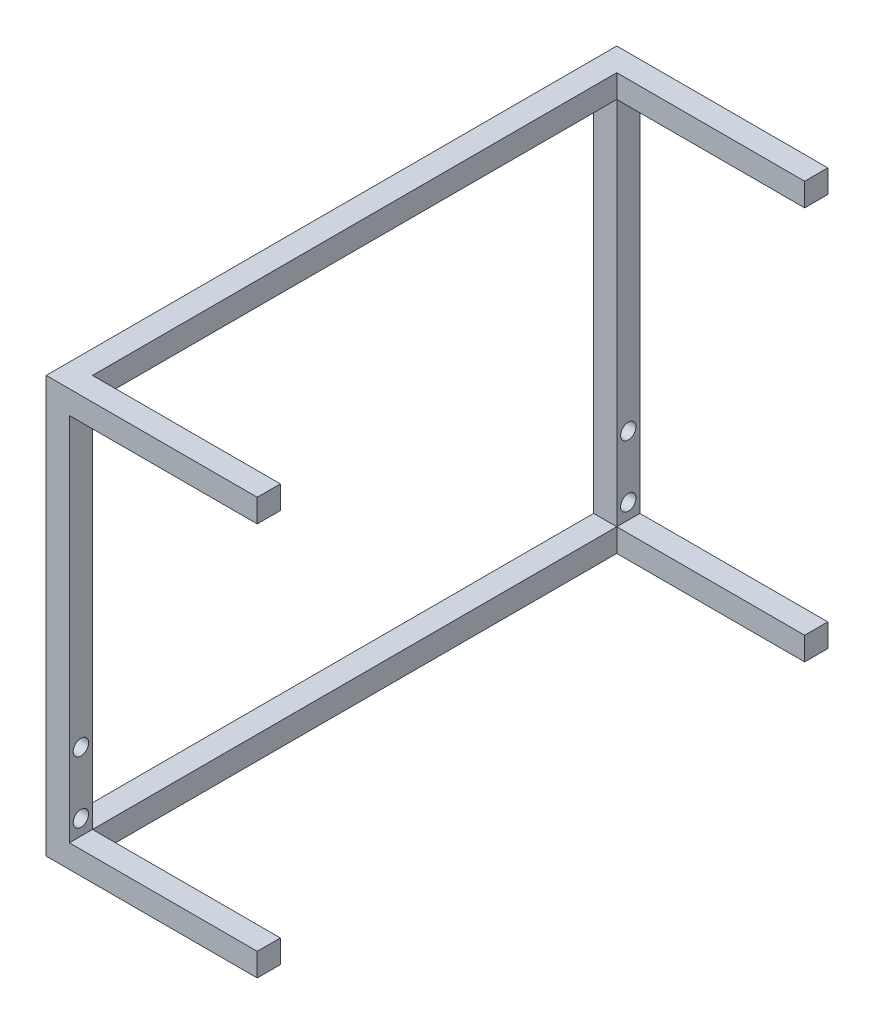
ISO-10303-21;
HEADER;
FILE_DESCRIPTION(('STEP AP214'),'2;1');
FILE_NAME('part.step','',(''),(''),'','','');
FILE_SCHEMA(('AUTOMOTIVE_DESIGN { 1 0 10303 214 1 1 1 1 }'));
ENDSEC;
DATA;
#1=APPLICATION_CONTEXT('core data for automotive mechanical design processes');
#2=APPLICATION_PROTOCOL_DEFINITION('international standard','automotive_design',2000,#1);
#3=PRODUCT_CONTEXT('',#1,'mechanical');
#4=PRODUCT('Part','Part','',(#3));
#5=PRODUCT_RELATED_PRODUCT_CATEGORY('part','',(#4));
#6=PRODUCT_DEFINITION_FORMATION('','',#4);
#7=PRODUCT_DEFINITION_CONTEXT('part definition',#1,'design');
#8=PRODUCT_DEFINITION('design','',#6,#7);
#9=PRODUCT_DEFINITION_SHAPE('','',#8);
#10=(LENGTH_UNIT() NAMED_UNIT(*) SI_UNIT(.MILLI.,.METRE.));
#11=(NAMED_UNIT(*) PLANE_ANGLE_UNIT() SI_UNIT($,.RADIAN.));
#12=(NAMED_UNIT(*) SI_UNIT($,.STERADIAN.) SOLID_ANGLE_UNIT());
#13=UNCERTAINTY_MEASURE_WITH_UNIT(LENGTH_MEASURE(1.E-05),#10,'distance_accuracy_value','');
#14=(GEOMETRIC_REPRESENTATION_CONTEXT(3) GLOBAL_UNCERTAINTY_ASSIGNED_CONTEXT((#13)) GLOBAL_UNIT_ASSIGNED_CONTEXT((#10,
#11,#12)) REPRESENTATION_CONTEXT('',''));
#15=CARTESIAN_POINT('',(0.,0.,0.));
#16=DIRECTION('',(0.,0.,1.));
#17=DIRECTION('',(1.,0.,0.));
#18=AXIS2_PLACEMENT_3D('',#15,#16,#17);
#19=CARTESIAN_POINT('',(19.05,0.,0.));
#20=DIRECTION('',(1.,0.,0.));
#21=DIRECTION('',(0.,0.,-1.));
#22=AXIS2_PLACEMENT_3D('',#19,#20,#21);
#23=PLANE('',#22);
#24=DIRECTION('',(0.,0.,-1.));
#25=VECTOR('',#24,1.);
#26=CARTESIAN_POINT('',(19.05,-66.9762658925101,0.));
#27=LINE('',#26,#25);
#28=CARTESIAN_POINT('',(19.05,-66.9762658925101,200.331506677718));
#29=VERTEX_POINT('',#28);
#30=CARTESIAN_POINT('',(19.05,-66.9762658925101,-231.468493322282));
#31=VERTEX_POINT('',#30);
#32=EDGE_CURVE('E52',#29,#31,#27,.T.);
#33=ORIENTED_EDGE('',*,*,#32,.T.);
#34=DIRECTION('',(0.,-1.,0.));
#35=VECTOR('',#34,1.);
#36=CARTESIAN_POINT('',(19.05,-47.9262658925101,-231.468493322282));
#37=LINE('',#36,#35);
#38=CARTESIAN_POINT('',(19.05,-47.9262658925101,-231.468493322282));
#39=VERTEX_POINT('',#38);
#40=EDGE_CURVE('E185',#39,#31,#37,.T.);
#41=ORIENTED_EDGE('',*,*,#40,.F.);
#42=DIRECTION('',(0.,0.,-1.));
#43=VECTOR('',#42,1.);
#44=CARTESIAN_POINT('',(19.05,-47.9262658925101,0.));
#45=LINE('',#44,#43);
#46=CARTESIAN_POINT('',(19.05,-47.9262658925101,200.331506677718));
#47=VERTEX_POINT('',#46);
#48=EDGE_CURVE('E280',#47,#39,#45,.T.);
#49=ORIENTED_EDGE('',*,*,#48,.F.);
#50=DIRECTION('',(0.,1.,0.));
#51=VECTOR('',#50,1.);
#52=CARTESIAN_POINT('',(19.05,-66.9762658925101,200.331506677718));
#53=LINE('',#52,#51);
#54=EDGE_CURVE('E235',#29,#47,#53,.T.);
#55=ORIENTED_EDGE('',*,*,#54,.F.);
#56=EDGE_LOOP('',(#33,#41,#49,#55));
#57=FACE_BOUND('',#56,.T.);
#58=ADVANCED_FACE('F35',(#57),#23,.T.);
#59=CARTESIAN_POINT('',(19.05,-35.2262658925101,-240.993493322282));
#60=DIRECTION('',(1.,0.,0.));
#61=DIRECTION('',(0.,0.,-1.));
#62=AXIS2_PLACEMENT_3D('',#59,#60,#61);
#63=CIRCLE('',#62,6.35);
#64=CARTESIAN_POINT('',(19.05,-35.2262658925101,-247.343493322282));
#65=VERTEX_POINT('',#64);
#66=EDGE_CURVE('E259',#65,#65,#63,.T.);
#67=ORIENTED_EDGE('',*,*,#66,.F.);
#68=EDGE_LOOP('',(#67));
#69=FACE_BOUND('',#68,.T.);
#70=CARTESIAN_POINT('',(19.05,15.5737341074899,-240.993493322282));
#71=DIRECTION('',(1.,0.,0.));
#72=DIRECTION('',(0.,0.,-1.));
#73=AXIS2_PLACEMENT_3D('',#70,#71,#72);
#74=CIRCLE('',#73,6.35);
#75=CARTESIAN_POINT('',(19.05,15.5737341074899,-247.343493322282));
#76=VERTEX_POINT('',#75);
#77=EDGE_CURVE('E262',#76,#76,#74,.T.);
#78=ORIENTED_EDGE('',*,*,#77,.F.);
#79=EDGE_LOOP('',(#78));
#80=FACE_BOUND('',#79,.T.);
#81=DIRECTION('',(0.,1.,0.));
#82=VECTOR('',#81,1.);
#83=CARTESIAN_POINT('',(19.05,0.,-231.468493322282));
#84=LINE('',#83,#82);
#85=CARTESIAN_POINT('',(19.05,256.87373410749,-231.468493322282));
#86=VERTEX_POINT('',#85);
#87=EDGE_CURVE('E288',#39,#86,#84,.T.);
#88=ORIENTED_EDGE('',*,*,#87,.F.);
#89=DIRECTION('',(0.,0.,1.));
#90=VECTOR('',#89,1.);
#91=CARTESIAN_POINT('',(19.05,-47.9262658925101,-231.468493322282));
#92=LINE('',#91,#90);
#93=CARTESIAN_POINT('',(19.05,-47.9262658925101,-250.518493322282));
#94=VERTEX_POINT('',#93);
#95=EDGE_CURVE('E182',#94,#39,#92,.T.);
#96=ORIENTED_EDGE('',*,*,#95,.F.);
#97=DIRECTION('',(0.,1.,0.));
#98=VECTOR('',#97,1.);
#99=CARTESIAN_POINT('',(19.05,0.,-250.518493322282));
#100=LINE('',#99,#98);
#101=CARTESIAN_POINT('',(19.05,256.87373410749,-250.518493322282));
#102=VERTEX_POINT('',#101);
#103=EDGE_CURVE('E276',#94,#102,#100,.T.);
#104=ORIENTED_EDGE('',*,*,#103,.T.);
#105=DIRECTION('',(0.,0.,-1.));
#106=VECTOR('',#105,1.);
#107=CARTESIAN_POINT('',(19.05,256.87373410749,-250.518493322282));
#108=LINE('',#107,#106);
#109=EDGE_CURVE('E189',#86,#102,#108,.T.);
#110=ORIENTED_EDGE('',*,*,#109,.F.);
#111=EDGE_LOOP('',(#88,#96,#104,#110));
#112=FACE_BOUND('',#111,.T.);
#113=ADVANCED_FACE('F357',(#69,#80,#112),#23,.T.);
#114=DIRECTION('',(0.,0.,-1.));
#115=VECTOR('',#114,1.);
#116=CARTESIAN_POINT('',(19.05,256.87373410749,0.));
#117=LINE('',#116,#115);
#118=CARTESIAN_POINT('',(19.05,256.87373410749,200.331506677718));
#119=VERTEX_POINT('',#118);
#120=EDGE_CURVE('E285',#119,#86,#117,.T.);
#121=ORIENTED_EDGE('',*,*,#120,.T.);
#122=DIRECTION('',(0.,-1.,0.));
#123=VECTOR('',#122,1.);
#124=CARTESIAN_POINT('',(19.05,275.92373410749,-231.468493322282));
#125=LINE('',#124,#123);
#126=CARTESIAN_POINT('',(19.05,275.92373410749,-231.468493322282));
#127=VERTEX_POINT('',#126);
#128=EDGE_CURVE('E186',#127,#86,#125,.T.);
#129=ORIENTED_EDGE('',*,*,#128,.F.);
#130=DIRECTION('',(0.,0.,-1.));
#131=VECTOR('',#130,1.);
#132=CARTESIAN_POINT('',(19.05,275.92373410749,0.));
#133=LINE('',#132,#131);
#134=CARTESIAN_POINT('',(19.05,275.92373410749,200.331506677718));
#135=VERTEX_POINT('',#134);
#136=EDGE_CURVE('E278',#135,#127,#133,.T.);
#137=ORIENTED_EDGE('',*,*,#136,.F.);
#138=DIRECTION('',(0.,1.,0.));
#139=VECTOR('',#138,1.);
#140=CARTESIAN_POINT('',(19.05,275.92373410749,200.331506677718));
#141=LINE('',#140,#139);
#142=EDGE_CURVE('E220',#119,#135,#141,.T.);
#143=ORIENTED_EDGE('',*,*,#142,.F.);
#144=EDGE_LOOP('',(#121,#129,#137,#143));
#145=FACE_BOUND('',#144,.T.);
#146=ADVANCED_FACE('F363',(#145),#23,.T.);
#147=CARTESIAN_POINT('',(19.05,-35.2262658925101,209.856506677718));
#148=DIRECTION('',(1.,0.,0.));
#149=DIRECTION('',(0.,0.,-1.));
#150=AXIS2_PLACEMENT_3D('',#147,#148,#149);
#151=CIRCLE('',#150,6.35);
#152=CARTESIAN_POINT('',(19.05,-35.2262658925101,203.506506677718));
#153=VERTEX_POINT('',#152);
#154=EDGE_CURVE('E263',#153,#153,#151,.T.);
#155=ORIENTED_EDGE('',*,*,#154,.F.);
#156=EDGE_LOOP('',(#155));
#157=FACE_BOUND('',#156,.T.);
#158=CARTESIAN_POINT('',(19.05,15.5737341074899,209.856506677718));
#159=DIRECTION('',(1.,0.,0.));
#160=DIRECTION('',(0.,0.,-1.));
#161=AXIS2_PLACEMENT_3D('',#158,#159,#160);
#162=CIRCLE('',#161,6.35);
#163=CARTESIAN_POINT('',(19.05,15.5737341074899,203.506506677718));
#164=VERTEX_POINT('',#163);
#165=EDGE_CURVE('E266',#164,#164,#162,.T.);
#166=ORIENTED_EDGE('',*,*,#165,.F.);
#167=EDGE_LOOP('',(#166));
#168=FACE_BOUND('',#167,.T.);
#169=DIRECTION('',(0.,-1.,0.));
#170=VECTOR('',#169,1.);
#171=CARTESIAN_POINT('',(19.05,0.,200.331506677718));
#172=LINE('',#171,#170);
#173=EDGE_CURVE('E283',#119,#47,#172,.T.);
#174=ORIENTED_EDGE('',*,*,#173,.F.);
#175=DIRECTION('',(0.,0.,-1.));
#176=VECTOR('',#175,1.);
#177=CARTESIAN_POINT('',(19.05,256.87373410749,219.381506677718));
#178=LINE('',#177,#176);
#179=CARTESIAN_POINT('',(19.05,256.87373410749,219.381506677718));
#180=VERTEX_POINT('',#179);
#181=EDGE_CURVE('E215',#180,#119,#178,.T.);
#182=ORIENTED_EDGE('',*,*,#181,.F.);
#183=DIRECTION('',(0.,-1.,0.));
#184=VECTOR('',#183,1.);
#185=CARTESIAN_POINT('',(19.05,0.,219.381506677718));
#186=LINE('',#185,#184);
#187=CARTESIAN_POINT('',(19.05,-47.9262658925101,219.381506677718));
#188=VERTEX_POINT('',#187);
#189=EDGE_CURVE('E272',#180,#188,#186,.T.);
#190=ORIENTED_EDGE('',*,*,#189,.T.);
#191=DIRECTION('',(0.,0.,1.));
#192=VECTOR('',#191,1.);
#193=CARTESIAN_POINT('',(19.05,-47.9262658925101,219.381506677718));
#194=LINE('',#193,#192);
#195=EDGE_CURVE('E240',#47,#188,#194,.T.);
#196=ORIENTED_EDGE('',*,*,#195,.F.);
#197=EDGE_LOOP('',(#174,#182,#190,#196));
#198=FACE_BOUND('',#197,.T.);
#199=ADVANCED_FACE('F359',(#157,#168,#198),#23,.T.);
#200=CARTESIAN_POINT('',(19.05,-47.9262658925101,0.));
#201=DIRECTION('',(0.,1.,0.));
#202=DIRECTION('',(0.,0.,1.));
#203=AXIS2_PLACEMENT_3D('',#200,#201,#202);
#204=PLANE('',#203);
#205=DIRECTION('',(0.,0.,-1.));
#206=VECTOR('',#205,1.);
#207=CARTESIAN_POINT('',(0.,-47.9262658925101,0.));
#208=LINE('',#207,#206);
#209=CARTESIAN_POINT('',(0.,-47.9262658925101,200.331506677718));
#210=VERTEX_POINT('',#209);
#211=CARTESIAN_POINT('',(0.,-47.9262658925101,-231.468493322282));
#212=VERTEX_POINT('',#211);
#213=EDGE_CURVE('E303',#210,#212,#208,.T.);
#214=ORIENTED_EDGE('',*,*,#213,.F.);
#215=DIRECTION('',(-1.,0.,0.));
#216=VECTOR('',#215,1.);
#217=CARTESIAN_POINT('',(19.05,-47.9262658925101,200.331506677718));
#218=LINE('',#217,#216);
#219=EDGE_CURVE('E11',#47,#210,#218,.T.);
#220=ORIENTED_EDGE('',*,*,#219,.F.);
#221=ORIENTED_EDGE('',*,*,#48,.T.);
#222=DIRECTION('',(-1.,0.,0.));
#223=VECTOR('',#222,1.);
#224=CARTESIAN_POINT('',(19.05,-47.9262658925101,-231.468493322282));
#225=LINE('',#224,#223);
#226=EDGE_CURVE('E314',#39,#212,#225,.T.);
#227=ORIENTED_EDGE('',*,*,#226,.T.);
#228=EDGE_LOOP('',(#214,#220,#221,#227));
#229=FACE_BOUND('',#228,.T.);
#230=ADVANCED_FACE('F368',(#229),#204,.T.);
#231=CARTESIAN_POINT('',(19.05,0.,200.331506677718));
#232=DIRECTION('',(0.,0.,-1.));
#233=DIRECTION('',(0.,1.,0.));
#234=AXIS2_PLACEMENT_3D('',#231,#232,#233);
#235=PLANE('',#234);
#236=DIRECTION('',(0.,-1.,0.));
#237=VECTOR('',#236,1.);
#238=CARTESIAN_POINT('',(0.,0.,200.331506677718));
#239=LINE('',#238,#237);
#240=CARTESIAN_POINT('',(0.,256.87373410749,200.331506677718));
#241=VERTEX_POINT('',#240);
#242=EDGE_CURVE('E306',#241,#210,#239,.T.);
#243=ORIENTED_EDGE('',*,*,#242,.F.);
#244=DIRECTION('',(-1.,0.,0.));
#245=VECTOR('',#244,1.);
#246=CARTESIAN_POINT('',(19.05,256.87373410749,200.331506677718));
#247=LINE('',#246,#245);
#248=EDGE_CURVE('E44',#119,#241,#247,.T.);
#249=ORIENTED_EDGE('',*,*,#248,.F.);
#250=ORIENTED_EDGE('',*,*,#173,.T.);
#251=ORIENTED_EDGE('',*,*,#219,.T.);
#252=EDGE_LOOP('',(#243,#249,#250,#251));
#253=FACE_BOUND('',#252,.T.);
#254=ADVANCED_FACE('F374',(#253),#235,.T.);
#255=CARTESIAN_POINT('',(19.05,256.87373410749,0.));
#256=DIRECTION('',(0.,1.,0.));
#257=DIRECTION('',(0.,0.,1.));
#258=AXIS2_PLACEMENT_3D('',#255,#256,#257);
#259=PLANE('',#258);
#260=DIRECTION('',(0.,0.,-1.));
#261=VECTOR('',#260,1.);
#262=CARTESIAN_POINT('',(0.,256.87373410749,0.));
#263=LINE('',#262,#261);
#264=CARTESIAN_POINT('',(0.,256.87373410749,-231.468493322282));
#265=VERTEX_POINT('',#264);
#266=EDGE_CURVE('E309',#241,#265,#263,.T.);
#267=ORIENTED_EDGE('',*,*,#266,.T.);
#268=DIRECTION('',(-1.,0.,0.));
#269=VECTOR('',#268,1.);
#270=CARTESIAN_POINT('',(19.05,256.87373410749,-231.468493322282));
#271=LINE('',#270,#269);
#272=EDGE_CURVE('E316',#86,#265,#271,.T.);
#273=ORIENTED_EDGE('',*,*,#272,.F.);
#274=ORIENTED_EDGE('',*,*,#120,.F.);
#275=ORIENTED_EDGE('',*,*,#248,.T.);
#276=EDGE_LOOP('',(#267,#273,#274,#275));
#277=FACE_BOUND('',#276,.T.);
#278=ADVANCED_FACE('F400',(#277),#259,.F.);
#279=CARTESIAN_POINT('',(19.05,0.,219.381506677718));
#280=DIRECTION('',(0.,0.,-1.));
#281=DIRECTION('',(0.,1.,0.));
#282=AXIS2_PLACEMENT_3D('',#279,#280,#281);
#283=PLANE('',#282);
#284=DIRECTION('',(0.,-1.,0.));
#285=VECTOR('',#284,1.);
#286=CARTESIAN_POINT('',(0.,0.,219.381506677718));
#287=LINE('',#286,#285);
#288=CARTESIAN_POINT('',(0.,275.92373410749,219.381506677718));
#289=VERTEX_POINT('',#288);
#290=CARTESIAN_POINT('',(0.,-66.9762658925101,219.381506677718));
#291=VERTEX_POINT('',#290);
#292=EDGE_CURVE('E292',#289,#291,#287,.T.);
#293=ORIENTED_EDGE('',*,*,#292,.T.);
#294=DIRECTION('',(-1.,0.,0.));
#295=VECTOR('',#294,1.);
#296=CARTESIAN_POINT('',(19.05,-66.9762658925101,219.381506677718));
#297=LINE('',#296,#295);
#298=CARTESIAN_POINT('',(173.7995,-66.9762658925101,219.381506677718));
#299=VERTEX_POINT('',#298);
#300=EDGE_CURVE('E317',#299,#291,#297,.T.);
#301=ORIENTED_EDGE('',*,*,#300,.F.);
#302=DIRECTION('',(0.,-1.,0.));
#303=VECTOR('',#302,1.);
#304=CARTESIAN_POINT('',(173.7995,-66.9762658925101,219.381506677718));
#305=LINE('',#304,#303);
#306=CARTESIAN_POINT('',(173.7995,-47.9262658925101,219.381506677718));
#307=VERTEX_POINT('',#306);
#308=EDGE_CURVE('E236',#307,#299,#305,.T.);
#309=ORIENTED_EDGE('',*,*,#308,.F.);
#310=DIRECTION('',(-1.,0.,0.));
#311=VECTOR('',#310,1.);
#312=CARTESIAN_POINT('',(173.7995,-47.9262658925101,219.381506677718));
#313=LINE('',#312,#311);
#314=EDGE_CURVE('E246',#307,#188,#313,.T.);
#315=ORIENTED_EDGE('',*,*,#314,.T.);
#316=ORIENTED_EDGE('',*,*,#189,.F.);
#317=DIRECTION('',(-1.,0.,0.));
#318=VECTOR('',#317,1.);
#319=CARTESIAN_POINT('',(173.7995,256.87373410749,219.381506677718));
#320=LINE('',#319,#318);
#321=CARTESIAN_POINT('',(173.7995,256.87373410749,219.381506677718));
#322=VERTEX_POINT('',#321);
#323=EDGE_CURVE('E233',#322,#180,#320,.T.);
#324=ORIENTED_EDGE('',*,*,#323,.F.);
#325=DIRECTION('',(0.,-1.,0.));
#326=VECTOR('',#325,1.);
#327=CARTESIAN_POINT('',(173.7995,275.92373410749,219.381506677718));
#328=LINE('',#327,#326);
#329=CARTESIAN_POINT('',(173.7995,275.92373410749,219.381506677718));
#330=VERTEX_POINT('',#329);
#331=EDGE_CURVE('E216',#330,#322,#328,.T.);
#332=ORIENTED_EDGE('',*,*,#331,.F.);
#333=DIRECTION('',(-1.,0.,0.));
#334=VECTOR('',#333,1.);
#335=CARTESIAN_POINT('',(19.05,275.92373410749,219.381506677718));
#336=LINE('',#335,#334);
#337=EDGE_CURVE('E291',#330,#289,#336,.T.);
#338=ORIENTED_EDGE('',*,*,#337,.T.);
#339=EDGE_LOOP('',(#293,#301,#309,#315,#316,#324,#332,#338));
#340=FACE_BOUND('',#339,.T.);
#341=ADVANCED_FACE('F37',(#340),#283,.F.);
#342=CARTESIAN_POINT('',(19.05,-66.9762658925101,0.));
#343=DIRECTION('',(0.,1.,0.));
#344=DIRECTION('',(0.,0.,1.));
#345=AXIS2_PLACEMENT_3D('',#342,#343,#344);
#346=PLANE('',#345);
#347=DIRECTION('',(0.,0.,-1.));
#348=VECTOR('',#347,1.);
#349=CARTESIAN_POINT('',(0.,-66.9762658925101,0.));
#350=LINE('',#349,#348);
#351=CARTESIAN_POINT('',(0.,-66.9762658925101,-250.518493322282));
#352=VERTEX_POINT('',#351);
#353=EDGE_CURVE('E295',#291,#352,#350,.T.);
#354=ORIENTED_EDGE('',*,*,#353,.T.);
#355=DIRECTION('',(-1.,0.,0.));
#356=VECTOR('',#355,1.);
#357=CARTESIAN_POINT('',(19.05,-66.9762658925101,-250.518493322282));
#358=LINE('',#357,#356);
#359=CARTESIAN_POINT('',(173.7995,-66.9762658925101,-250.518493322282));
#360=VERTEX_POINT('',#359);
#361=EDGE_CURVE('E169',#360,#352,#358,.T.);
#362=ORIENTED_EDGE('',*,*,#361,.F.);
#363=DIRECTION('',(0.,0.,-1.));
#364=VECTOR('',#363,1.);
#365=CARTESIAN_POINT('',(173.7995,-66.9762658925101,-231.468493322282));
#366=LINE('',#365,#364);
#367=CARTESIAN_POINT('',(173.7995,-66.9762658925101,-231.468493322282));
#368=VERTEX_POINT('',#367);
#369=EDGE_CURVE('E162',#368,#360,#366,.T.);
#370=ORIENTED_EDGE('',*,*,#369,.F.);
#371=DIRECTION('',(-1.,0.,0.));
#372=VECTOR('',#371,1.);
#373=CARTESIAN_POINT('',(173.7995,-66.9762658925101,-231.468493322282));
#374=LINE('',#373,#372);
#375=EDGE_CURVE('E166',#368,#31,#374,.T.);
#376=ORIENTED_EDGE('',*,*,#375,.T.);
#377=ORIENTED_EDGE('',*,*,#32,.F.);
#378=DIRECTION('',(-1.,0.,0.));
#379=VECTOR('',#378,1.);
#380=CARTESIAN_POINT('',(173.7995,-66.9762658925101,200.331506677718));
#381=LINE('',#380,#379);
#382=CARTESIAN_POINT('',(173.7995,-66.9762658925101,200.331506677718));
#383=VERTEX_POINT('',#382);
#384=EDGE_CURVE('E256',#383,#29,#381,.T.);
#385=ORIENTED_EDGE('',*,*,#384,.F.);
#386=DIRECTION('',(0.,0.,-1.));
#387=VECTOR('',#386,1.);
#388=CARTESIAN_POINT('',(173.7995,-66.9762658925101,219.381506677718));
#389=LINE('',#388,#387);
#390=EDGE_CURVE('E239',#299,#383,#389,.T.);
#391=ORIENTED_EDGE('',*,*,#390,.F.);
#392=ORIENTED_EDGE('',*,*,#300,.T.);
#393=EDGE_LOOP('',(#354,#362,#370,#376,#377,#385,#391,#392));
#394=FACE_BOUND('',#393,.T.);
#395=ADVANCED_FACE('F164',(#394),#346,.F.);
#396=CARTESIAN_POINT('',(19.05,0.,-250.518493322282));
#397=DIRECTION('',(0.,0.,1.));
#398=DIRECTION('',(1.,0.,0.));
#399=AXIS2_PLACEMENT_3D('',#396,#397,#398);
#400=PLANE('',#399);
#401=DIRECTION('',(0.,1.,0.));
#402=VECTOR('',#401,1.);
#403=CARTESIAN_POINT('',(0.,0.,-250.518493322282));
#404=LINE('',#403,#402);
#405=CARTESIAN_POINT('',(0.,275.92373410749,-250.518493322282));
#406=VERTEX_POINT('',#405);
#407=EDGE_CURVE('E297',#352,#406,#404,.T.);
#408=ORIENTED_EDGE('',*,*,#407,.T.);
#409=DIRECTION('',(-1.,0.,0.));
#410=VECTOR('',#409,1.);
#411=CARTESIAN_POINT('',(19.05,275.92373410749,-250.518493322282));
#412=LINE('',#411,#410);
#413=CARTESIAN_POINT('',(173.7995,275.92373410749,-250.518493322282));
#414=VERTEX_POINT('',#413);
#415=EDGE_CURVE('E321',#414,#406,#412,.T.);
#416=ORIENTED_EDGE('',*,*,#415,.F.);
#417=DIRECTION('',(0.,1.,0.));
#418=VECTOR('',#417,1.);
#419=CARTESIAN_POINT('',(173.7995,275.92373410749,-250.518493322282));
#420=LINE('',#419,#418);
#421=CARTESIAN_POINT('',(173.7995,256.87373410749,-250.518493322282));
#422=VERTEX_POINT('',#421);
#423=EDGE_CURVE('E196',#422,#414,#420,.T.);
#424=ORIENTED_EDGE('',*,*,#423,.F.);
#425=DIRECTION('',(-1.,0.,0.));
#426=VECTOR('',#425,1.);
#427=CARTESIAN_POINT('',(173.7995,256.87373410749,-250.518493322282));
#428=LINE('',#427,#426);
#429=EDGE_CURVE('E204',#422,#102,#428,.T.);
#430=ORIENTED_EDGE('',*,*,#429,.T.);
#431=ORIENTED_EDGE('',*,*,#103,.F.);
#432=DIRECTION('',(-1.,0.,0.));
#433=VECTOR('',#432,1.);
#434=CARTESIAN_POINT('',(173.7995,-47.9262658925101,-250.518493322282));
#435=LINE('',#434,#433);
#436=CARTESIAN_POINT('',(173.7995,-47.9262658925101,-250.518493322282));
#437=VERTEX_POINT('',#436);
#438=EDGE_CURVE('E187',#437,#94,#435,.T.);
#439=ORIENTED_EDGE('',*,*,#438,.F.);
#440=DIRECTION('',(0.,1.,0.));
#441=VECTOR('',#440,1.);
#442=CARTESIAN_POINT('',(173.7995,-47.9262658925101,-250.518493322282));
#443=LINE('',#442,#441);
#444=EDGE_CURVE('E172',#360,#437,#443,.T.);
#445=ORIENTED_EDGE('',*,*,#444,.F.);
#446=ORIENTED_EDGE('',*,*,#361,.T.);
#447=EDGE_LOOP('',(#408,#416,#424,#430,#431,#439,#445,#446));
#448=FACE_BOUND('',#447,.T.);
#449=ADVANCED_FACE('F432',(#448),#400,.F.);
#450=CARTESIAN_POINT('',(19.05,275.92373410749,0.));
#451=DIRECTION('',(0.,1.,0.));
#452=DIRECTION('',(0.,0.,1.));
#453=AXIS2_PLACEMENT_3D('',#450,#451,#452);
#454=PLANE('',#453);
#455=DIRECTION('',(0.,0.,-1.));
#456=VECTOR('',#455,1.);
#457=CARTESIAN_POINT('',(0.,275.92373410749,0.));
#458=LINE('',#457,#456);
#459=EDGE_CURVE('E300',#289,#406,#458,.T.);
#460=ORIENTED_EDGE('',*,*,#459,.F.);
#461=ORIENTED_EDGE('',*,*,#337,.F.);
#462=DIRECTION('',(0.,0.,1.));
#463=VECTOR('',#462,1.);
#464=CARTESIAN_POINT('',(173.7995,275.92373410749,219.381506677718));
#465=LINE('',#464,#463);
#466=CARTESIAN_POINT('',(173.7995,275.92373410749,200.331506677718));
#467=VERTEX_POINT('',#466);
#468=EDGE_CURVE('E224',#467,#330,#465,.T.);
#469=ORIENTED_EDGE('',*,*,#468,.F.);
#470=DIRECTION('',(-1.,0.,0.));
#471=VECTOR('',#470,1.);
#472=CARTESIAN_POINT('',(173.7995,275.92373410749,200.331506677718));
#473=LINE('',#472,#471);
#474=EDGE_CURVE('E60',#467,#135,#473,.T.);
#475=ORIENTED_EDGE('',*,*,#474,.T.);
#476=ORIENTED_EDGE('',*,*,#136,.T.);
#477=DIRECTION('',(-1.,0.,0.));
#478=VECTOR('',#477,1.);
#479=CARTESIAN_POINT('',(173.7995,275.92373410749,-231.468493322282));
#480=LINE('',#479,#478);
#481=CARTESIAN_POINT('',(173.7995,275.92373410749,-231.468493322282));
#482=VERTEX_POINT('',#481);
#483=EDGE_CURVE('E213',#482,#127,#480,.T.);
#484=ORIENTED_EDGE('',*,*,#483,.F.);
#485=DIRECTION('',(0.,0.,1.));
#486=VECTOR('',#485,1.);
#487=CARTESIAN_POINT('',(173.7995,275.92373410749,-250.518493322282));
#488=LINE('',#487,#486);
#489=EDGE_CURVE('E199',#414,#482,#488,.T.);
#490=ORIENTED_EDGE('',*,*,#489,.F.);
#491=ORIENTED_EDGE('',*,*,#415,.T.);
#492=EDGE_LOOP('',(#460,#461,#469,#475,#476,#484,#490,#491));
#493=FACE_BOUND('',#492,.T.);
#494=ADVANCED_FACE('F427',(#493),#454,.T.);
#495=CARTESIAN_POINT('',(19.05,0.,-231.468493322282));
#496=DIRECTION('',(0.,0.,1.));
#497=DIRECTION('',(0.,-1.,0.));
#498=AXIS2_PLACEMENT_3D('',#495,#496,#497);
#499=PLANE('',#498);
#500=DIRECTION('',(0.,1.,0.));
#501=VECTOR('',#500,1.);
#502=CARTESIAN_POINT('',(0.,0.,-231.468493322282));
#503=LINE('',#502,#501);
#504=EDGE_CURVE('E274',#212,#265,#503,.T.);
#505=ORIENTED_EDGE('',*,*,#504,.F.);
#506=ORIENTED_EDGE('',*,*,#226,.F.);
#507=ORIENTED_EDGE('',*,*,#87,.T.);
#508=ORIENTED_EDGE('',*,*,#272,.T.);
#509=EDGE_LOOP('',(#505,#506,#507,#508));
#510=FACE_BOUND('',#509,.T.);
#511=ADVANCED_FACE('F445',(#510),#499,.T.);
#512=CARTESIAN_POINT('',(0.,0.,0.));
#513=DIRECTION('',(1.,0.,0.));
#514=DIRECTION('',(0.,0.,-1.));
#515=AXIS2_PLACEMENT_3D('',#512,#513,#514);
#516=PLANE('',#515);
#517=CARTESIAN_POINT('',(0.,-35.2262658925101,209.856506677718));
#518=DIRECTION('',(1.,0.,0.));
#519=DIRECTION('',(0.,0.,-1.));
#520=AXIS2_PLACEMENT_3D('',#517,#518,#519);
#521=CIRCLE('',#520,6.35);
#522=CARTESIAN_POINT('',(0.,-35.2262658925101,203.506506677718));
#523=VERTEX_POINT('',#522);
#524=EDGE_CURVE('E39',#523,#523,#521,.T.);
#525=ORIENTED_EDGE('',*,*,#524,.T.);
#526=EDGE_LOOP('',(#525));
#527=FACE_BOUND('',#526,.T.);
#528=CARTESIAN_POINT('',(0.,15.5737341074899,-240.993493322282));
#529=DIRECTION('',(1.,0.,0.));
#530=DIRECTION('',(0.,0.,-1.));
#531=AXIS2_PLACEMENT_3D('',#528,#529,#530);
#532=CIRCLE('',#531,6.35);
#533=CARTESIAN_POINT('',(0.,15.5737341074899,-247.343493322282));
#534=VERTEX_POINT('',#533);
#535=EDGE_CURVE('E330',#534,#534,#532,.T.);
#536=ORIENTED_EDGE('',*,*,#535,.T.);
#537=EDGE_LOOP('',(#536));
#538=FACE_BOUND('',#537,.T.);
#539=CARTESIAN_POINT('',(0.,-35.2262658925101,-240.993493322282));
#540=DIRECTION('',(1.,0.,0.));
#541=DIRECTION('',(0.,0.,-1.));
#542=AXIS2_PLACEMENT_3D('',#539,#540,#541);
#543=CIRCLE('',#542,6.35);
#544=CARTESIAN_POINT('',(0.,-35.2262658925101,-247.343493322282));
#545=VERTEX_POINT('',#544);
#546=EDGE_CURVE('E328',#545,#545,#543,.T.);
#547=ORIENTED_EDGE('',*,*,#546,.T.);
#548=EDGE_LOOP('',(#547));
#549=FACE_BOUND('',#548,.T.);
#550=CARTESIAN_POINT('',(0.,15.5737341074899,209.856506677718));
#551=DIRECTION('',(1.,0.,0.));
#552=DIRECTION('',(0.,0.,-1.));
#553=AXIS2_PLACEMENT_3D('',#550,#551,#552);
#554=CIRCLE('',#553,6.35);
#555=CARTESIAN_POINT('',(0.,15.5737341074899,203.506506677718));
#556=VERTEX_POINT('',#555);
#557=EDGE_CURVE('E271',#556,#556,#554,.T.);
#558=ORIENTED_EDGE('',*,*,#557,.T.);
#559=EDGE_LOOP('',(#558));
#560=FACE_BOUND('',#559,.T.);
#561=ORIENTED_EDGE('',*,*,#292,.F.);
#562=ORIENTED_EDGE('',*,*,#459,.T.);
#563=ORIENTED_EDGE('',*,*,#407,.F.);
#564=ORIENTED_EDGE('',*,*,#353,.F.);
#565=EDGE_LOOP('',(#561,#562,#563,#564));
#566=FACE_BOUND('',#565,.T.);
#567=ORIENTED_EDGE('',*,*,#213,.T.);
#568=ORIENTED_EDGE('',*,*,#504,.T.);
#569=ORIENTED_EDGE('',*,*,#266,.F.);
#570=ORIENTED_EDGE('',*,*,#242,.T.);
#571=EDGE_LOOP('',(#567,#568,#569,#570));
#572=FACE_BOUND('',#571,.T.);
#573=ADVANCED_FACE('F337',(#527,#538,#549,#560,#566,#572),#516,.F.);
#574=CARTESIAN_POINT('',(-6.35,15.5737341074899,209.856506677718));
#575=DIRECTION('',(1.,0.,0.));
#576=DIRECTION('',(0.,0.,-1.));
#577=AXIS2_PLACEMENT_3D('',#574,#575,#576);
#578=CYLINDRICAL_SURFACE('',#577,6.35);
#579=ORIENTED_EDGE('',*,*,#165,.T.);
#580=EDGE_LOOP('',(#579));
#581=FACE_BOUND('',#580,.T.);
#582=ORIENTED_EDGE('',*,*,#557,.F.);
#583=EDGE_LOOP('',(#582));
#584=FACE_BOUND('',#583,.T.);
#585=ADVANCED_FACE('F452',(#581,#584),#578,.F.);
#586=CARTESIAN_POINT('',(-6.35,-35.2262658925101,-240.993493322282));
#587=DIRECTION('',(1.,0.,0.));
#588=DIRECTION('',(0.,0.,-1.));
#589=AXIS2_PLACEMENT_3D('',#586,#587,#588);
#590=CYLINDRICAL_SURFACE('',#589,6.35);
#591=ORIENTED_EDGE('',*,*,#66,.T.);
#592=EDGE_LOOP('',(#591));
#593=FACE_BOUND('',#592,.T.);
#594=ORIENTED_EDGE('',*,*,#546,.F.);
#595=EDGE_LOOP('',(#594));
#596=FACE_BOUND('',#595,.T.);
#597=ADVANCED_FACE('F352',(#593,#596),#590,.F.);
#598=CARTESIAN_POINT('',(-6.35,15.5737341074899,-240.993493322282));
#599=DIRECTION('',(1.,0.,0.));
#600=DIRECTION('',(0.,0.,-1.));
#601=AXIS2_PLACEMENT_3D('',#598,#599,#600);
#602=CYLINDRICAL_SURFACE('',#601,6.35);
#603=ORIENTED_EDGE('',*,*,#77,.T.);
#604=EDGE_LOOP('',(#603));
#605=FACE_BOUND('',#604,.T.);
#606=ORIENTED_EDGE('',*,*,#535,.F.);
#607=EDGE_LOOP('',(#606));
#608=FACE_BOUND('',#607,.T.);
#609=ADVANCED_FACE('F342',(#605,#608),#602,.F.);
#610=CARTESIAN_POINT('',(-6.35,-35.2262658925101,209.856506677718));
#611=DIRECTION('',(1.,0.,0.));
#612=DIRECTION('',(0.,0.,-1.));
#613=AXIS2_PLACEMENT_3D('',#610,#611,#612);
#614=CYLINDRICAL_SURFACE('',#613,6.35);
#615=ORIENTED_EDGE('',*,*,#154,.T.);
#616=EDGE_LOOP('',(#615));
#617=FACE_BOUND('',#616,.T.);
#618=ORIENTED_EDGE('',*,*,#524,.F.);
#619=EDGE_LOOP('',(#618));
#620=FACE_BOUND('',#619,.T.);
#621=ADVANCED_FACE('F339',(#617,#620),#614,.F.);
#622=CARTESIAN_POINT('',(173.7995,-66.9762658925101,200.331506677718));
#623=DIRECTION('',(0.,0.,1.));
#624=DIRECTION('',(1.,0.,0.));
#625=AXIS2_PLACEMENT_3D('',#622,#623,#624);
#626=PLANE('',#625);
#627=ORIENTED_EDGE('',*,*,#54,.T.);
#628=DIRECTION('',(-1.,0.,0.));
#629=VECTOR('',#628,1.);
#630=CARTESIAN_POINT('',(173.7995,-47.9262658925101,200.331506677718));
#631=LINE('',#630,#629);
#632=CARTESIAN_POINT('',(173.7995,-47.9262658925101,200.331506677718));
#633=VERTEX_POINT('',#632);
#634=EDGE_CURVE('E253',#633,#47,#631,.T.);
#635=ORIENTED_EDGE('',*,*,#634,.F.);
#636=DIRECTION('',(0.,1.,0.));
#637=VECTOR('',#636,1.);
#638=CARTESIAN_POINT('',(173.7995,-66.9762658925101,200.331506677718));
#639=LINE('',#638,#637);
#640=EDGE_CURVE('E242',#383,#633,#639,.T.);
#641=ORIENTED_EDGE('',*,*,#640,.F.);
#642=ORIENTED_EDGE('',*,*,#384,.T.);
#643=EDGE_LOOP('',(#627,#635,#641,#642));
#644=FACE_BOUND('',#643,.T.);
#645=ADVANCED_FACE('F341',(#644),#626,.F.);
#646=CARTESIAN_POINT('',(173.7995,-47.9262658925101,219.381506677718));
#647=DIRECTION('',(0.,-1.,0.));
#648=DIRECTION('',(0.,0.,-1.));
#649=AXIS2_PLACEMENT_3D('',#646,#647,#648);
#650=PLANE('',#649);
#651=ORIENTED_EDGE('',*,*,#195,.T.);
#652=ORIENTED_EDGE('',*,*,#314,.F.);
#653=DIRECTION('',(0.,0.,1.));
#654=VECTOR('',#653,1.);
#655=CARTESIAN_POINT('',(173.7995,-47.9262658925101,219.381506677718));
#656=LINE('',#655,#654);
#657=EDGE_CURVE('E244',#633,#307,#656,.T.);
#658=ORIENTED_EDGE('',*,*,#657,.F.);
#659=ORIENTED_EDGE('',*,*,#634,.T.);
#660=EDGE_LOOP('',(#651,#652,#658,#659));
#661=FACE_BOUND('',#660,.T.);
#662=ADVANCED_FACE('F349',(#661),#650,.F.);
#663=CARTESIAN_POINT('',(173.7995,0.,0.));
#664=DIRECTION('',(-1.,0.,0.));
#665=DIRECTION('',(0.,0.,1.));
#666=AXIS2_PLACEMENT_3D('',#663,#664,#665);
#667=PLANE('',#666);
#668=ORIENTED_EDGE('',*,*,#308,.T.);
#669=ORIENTED_EDGE('',*,*,#390,.T.);
#670=ORIENTED_EDGE('',*,*,#640,.T.);
#671=ORIENTED_EDGE('',*,*,#657,.T.);
#672=EDGE_LOOP('',(#668,#669,#670,#671));
#673=FACE_BOUND('',#672,.T.);
#674=ADVANCED_FACE('F422',(#673),#667,.F.);
#675=CARTESIAN_POINT('',(173.7995,256.87373410749,219.381506677718));
#676=DIRECTION('',(0.,1.,0.));
#677=DIRECTION('',(0.,0.,1.));
#678=AXIS2_PLACEMENT_3D('',#675,#676,#677);
#679=PLANE('',#678);
#680=ORIENTED_EDGE('',*,*,#181,.T.);
#681=DIRECTION('',(-1.,0.,0.));
#682=VECTOR('',#681,1.);
#683=CARTESIAN_POINT('',(173.7995,256.87373410749,200.331506677718));
#684=LINE('',#683,#682);
#685=CARTESIAN_POINT('',(173.7995,256.87373410749,200.331506677718));
#686=VERTEX_POINT('',#685);
#687=EDGE_CURVE('E230',#686,#119,#684,.T.);
#688=ORIENTED_EDGE('',*,*,#687,.F.);
#689=DIRECTION('',(0.,0.,-1.));
#690=VECTOR('',#689,1.);
#691=CARTESIAN_POINT('',(173.7995,256.87373410749,219.381506677718));
#692=LINE('',#691,#690);
#693=EDGE_CURVE('E219',#322,#686,#692,.T.);
#694=ORIENTED_EDGE('',*,*,#693,.F.);
#695=ORIENTED_EDGE('',*,*,#323,.T.);
#696=EDGE_LOOP('',(#680,#688,#694,#695));
#697=FACE_BOUND('',#696,.T.);
#698=ADVANCED_FACE('F409',(#697),#679,.F.);
#699=CARTESIAN_POINT('',(173.7995,275.92373410749,200.331506677718));
#700=DIRECTION('',(0.,0.,1.));
#701=DIRECTION('',(1.,0.,0.));
#702=AXIS2_PLACEMENT_3D('',#699,#700,#701);
#703=PLANE('',#702);
#704=ORIENTED_EDGE('',*,*,#142,.T.);
#705=ORIENTED_EDGE('',*,*,#474,.F.);
#706=DIRECTION('',(0.,1.,0.));
#707=VECTOR('',#706,1.);
#708=CARTESIAN_POINT('',(173.7995,275.92373410749,200.331506677718));
#709=LINE('',#708,#707);
#710=EDGE_CURVE('E222',#686,#467,#709,.T.);
#711=ORIENTED_EDGE('',*,*,#710,.F.);
#712=ORIENTED_EDGE('',*,*,#687,.T.);
#713=EDGE_LOOP('',(#704,#705,#711,#712));
#714=FACE_BOUND('',#713,.T.);
#715=ADVANCED_FACE('F405',(#714),#703,.F.);
#716=CARTESIAN_POINT('',(173.7995,0.,0.));
#717=DIRECTION('',(1.,0.,0.));
#718=DIRECTION('',(0.,0.,-1.));
#719=AXIS2_PLACEMENT_3D('',#716,#717,#718);
#720=PLANE('',#719);
#721=ORIENTED_EDGE('',*,*,#331,.T.);
#722=ORIENTED_EDGE('',*,*,#693,.T.);
#723=ORIENTED_EDGE('',*,*,#710,.T.);
#724=ORIENTED_EDGE('',*,*,#468,.T.);
#725=EDGE_LOOP('',(#721,#722,#723,#724));
#726=FACE_BOUND('',#725,.T.);
#727=ADVANCED_FACE('F600',(#726),#720,.T.);
#728=CARTESIAN_POINT('',(173.7995,275.92373410749,-231.468493322282));
#729=DIRECTION('',(0.,0.,-1.));
#730=DIRECTION('',(-1.,0.,0.));
#731=AXIS2_PLACEMENT_3D('',#728,#729,#730);
#732=PLANE('',#731);
#733=ORIENTED_EDGE('',*,*,#128,.T.);
#734=DIRECTION('',(-1.,0.,0.));
#735=VECTOR('',#734,1.);
#736=CARTESIAN_POINT('',(173.7995,256.87373410749,-231.468493322282));
#737=LINE('',#736,#735);
#738=CARTESIAN_POINT('',(173.7995,256.87373410749,-231.468493322282));
#739=VERTEX_POINT('',#738);
#740=EDGE_CURVE('E210',#739,#86,#737,.T.);
#741=ORIENTED_EDGE('',*,*,#740,.F.);
#742=DIRECTION('',(0.,-1.,0.));
#743=VECTOR('',#742,1.);
#744=CARTESIAN_POINT('',(173.7995,275.92373410749,-231.468493322282));
#745=LINE('',#744,#743);
#746=EDGE_CURVE('E201',#482,#739,#745,.T.);
#747=ORIENTED_EDGE('',*,*,#746,.F.);
#748=ORIENTED_EDGE('',*,*,#483,.T.);
#749=EDGE_LOOP('',(#733,#741,#747,#748));
#750=FACE_BOUND('',#749,.T.);
#751=ADVANCED_FACE('F609',(#750),#732,.F.);
#752=CARTESIAN_POINT('',(173.7995,256.87373410749,-250.518493322282));
#753=DIRECTION('',(0.,1.,0.));
#754=DIRECTION('',(0.,0.,1.));
#755=AXIS2_PLACEMENT_3D('',#752,#753,#754);
#756=PLANE('',#755);
#757=ORIENTED_EDGE('',*,*,#109,.T.);
#758=ORIENTED_EDGE('',*,*,#429,.F.);
#759=DIRECTION('',(0.,0.,-1.));
#760=VECTOR('',#759,1.);
#761=CARTESIAN_POINT('',(173.7995,256.87373410749,-250.518493322282));
#762=LINE('',#761,#760);
#763=EDGE_CURVE('E203',#739,#422,#762,.T.);
#764=ORIENTED_EDGE('',*,*,#763,.F.);
#765=ORIENTED_EDGE('',*,*,#740,.T.);
#766=EDGE_LOOP('',(#757,#758,#764,#765));
#767=FACE_BOUND('',#766,.T.);
#768=ADVANCED_FACE('F619',(#767),#756,.F.);
#769=CARTESIAN_POINT('',(173.7995,0.,0.));
#770=DIRECTION('',(-1.,0.,0.));
#771=DIRECTION('',(0.,0.,1.));
#772=AXIS2_PLACEMENT_3D('',#769,#770,#771);
#773=PLANE('',#772);
#774=ORIENTED_EDGE('',*,*,#423,.T.);
#775=ORIENTED_EDGE('',*,*,#489,.T.);
#776=ORIENTED_EDGE('',*,*,#746,.T.);
#777=ORIENTED_EDGE('',*,*,#763,.T.);
#778=EDGE_LOOP('',(#774,#775,#776,#777));
#779=FACE_BOUND('',#778,.T.);
#780=ADVANCED_FACE('F629',(#779),#773,.F.);
#781=CARTESIAN_POINT('',(173.7995,-47.9262658925101,-231.468493322282));
#782=DIRECTION('',(0.,0.,-1.));
#783=DIRECTION('',(-1.,0.,0.));
#784=AXIS2_PLACEMENT_3D('',#781,#782,#783);
#785=PLANE('',#784);
#786=ORIENTED_EDGE('',*,*,#40,.T.);
#787=ORIENTED_EDGE('',*,*,#375,.F.);
#788=DIRECTION('',(0.,-1.,0.));
#789=VECTOR('',#788,1.);
#790=CARTESIAN_POINT('',(173.7995,-47.9262658925101,-231.468493322282));
#791=LINE('',#790,#789);
#792=CARTESIAN_POINT('',(173.7995,-47.9262658925101,-231.468493322282));
#793=VERTEX_POINT('',#792);
#794=EDGE_CURVE('E173',#793,#368,#791,.T.);
#795=ORIENTED_EDGE('',*,*,#794,.F.);
#796=DIRECTION('',(-1.,0.,0.));
#797=VECTOR('',#796,1.);
#798=CARTESIAN_POINT('',(173.7995,-47.9262658925101,-231.468493322282));
#799=LINE('',#798,#797);
#800=EDGE_CURVE('E192',#793,#39,#799,.T.);
#801=ORIENTED_EDGE('',*,*,#800,.T.);
#802=EDGE_LOOP('',(#786,#787,#795,#801));
#803=FACE_BOUND('',#802,.T.);
#804=ADVANCED_FACE('F184',(#803),#785,.F.);
#805=CARTESIAN_POINT('',(173.7995,-47.9262658925101,-231.468493322282));
#806=DIRECTION('',(0.,-1.,0.));
#807=DIRECTION('',(0.,0.,-1.));
#808=AXIS2_PLACEMENT_3D('',#805,#806,#807);
#809=PLANE('',#808);
#810=ORIENTED_EDGE('',*,*,#95,.T.);
#811=ORIENTED_EDGE('',*,*,#800,.F.);
#812=DIRECTION('',(0.,0.,1.));
#813=VECTOR('',#812,1.);
#814=CARTESIAN_POINT('',(173.7995,-47.9262658925101,-231.468493322282));
#815=LINE('',#814,#813);
#816=EDGE_CURVE('E178',#437,#793,#815,.T.);
#817=ORIENTED_EDGE('',*,*,#816,.F.);
#818=ORIENTED_EDGE('',*,*,#438,.T.);
#819=EDGE_LOOP('',(#810,#811,#817,#818));
#820=FACE_BOUND('',#819,.T.);
#821=ADVANCED_FACE('F440',(#820),#809,.F.);
#822=CARTESIAN_POINT('',(173.7995,0.,0.));
#823=DIRECTION('',(1.,0.,0.));
#824=DIRECTION('',(0.,0.,-1.));
#825=AXIS2_PLACEMENT_3D('',#822,#823,#824);
#826=PLANE('',#825);
#827=ORIENTED_EDGE('',*,*,#794,.T.);
#828=ORIENTED_EDGE('',*,*,#369,.T.);
#829=ORIENTED_EDGE('',*,*,#444,.T.);
#830=ORIENTED_EDGE('',*,*,#816,.T.);
#831=EDGE_LOOP('',(#827,#828,#829,#830));
#832=FACE_BOUND('',#831,.T.);
#833=ADVANCED_FACE('F176',(#832),#826,.T.);
#834=CLOSED_SHELL('',(#58,#113,#146,#199,#230,#254,#278,#341,#395,#449,#494,#511,#573,#585,#597,
#609,#621,#645,#662,#674,#698,#715,#727,#751,#768,#780,#804,#821,#833));
#835=MANIFOLD_SOLID_BREP('B2',#834);
#836=ADVANCED_BREP_SHAPE_REPRESENTATION('',(#18,#835),#14);
#837=SHAPE_DEFINITION_REPRESENTATION(#9,#836);
ENDSEC;
END-ISO-10303-21;
